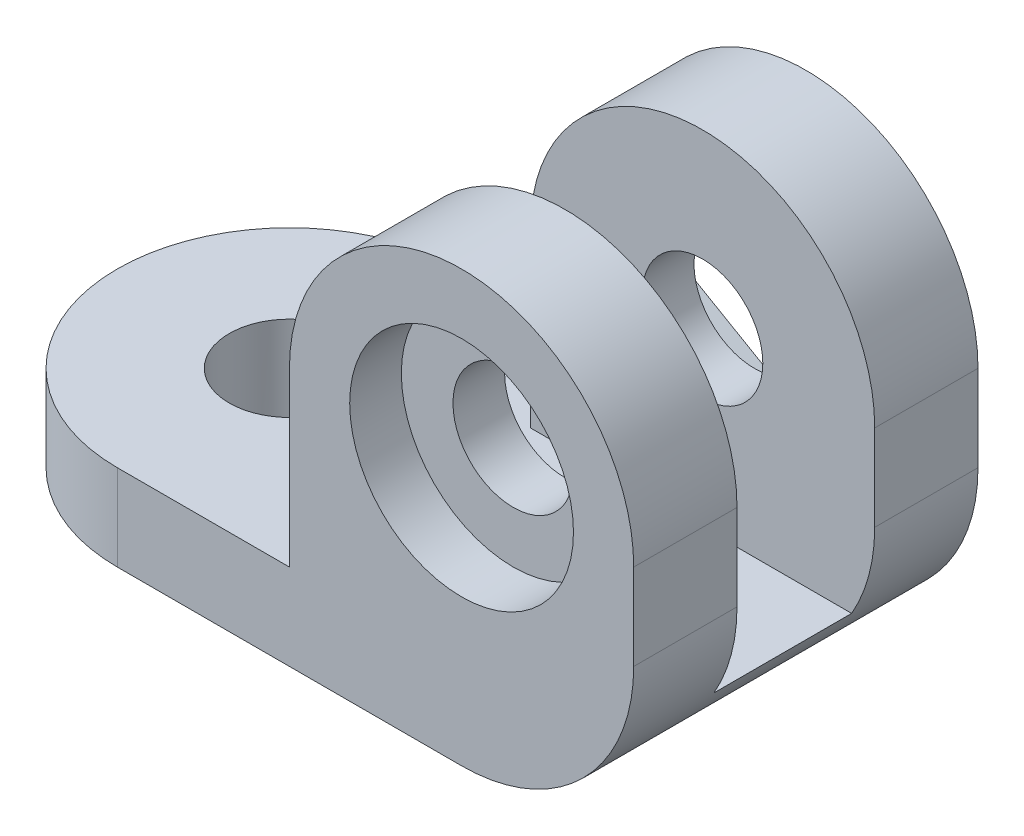
ISO-10303-21;
HEADER;
FILE_DESCRIPTION(('STEP AP214'),'2;1');
FILE_NAME('part.step','',(''),(''),'','','');
FILE_SCHEMA(('AUTOMOTIVE_DESIGN { 1 0 10303 214 1 1 1 1 }'));
ENDSEC;
DATA;
#1=APPLICATION_CONTEXT('core data for automotive mechanical design processes');
#2=APPLICATION_PROTOCOL_DEFINITION('international standard','automotive_design',2000,#1);
#3=PRODUCT_CONTEXT('',#1,'mechanical');
#4=PRODUCT('Part','Part','',(#3));
#5=PRODUCT_RELATED_PRODUCT_CATEGORY('part','',(#4));
#6=PRODUCT_DEFINITION_FORMATION('','',#4);
#7=PRODUCT_DEFINITION_CONTEXT('part definition',#1,'design');
#8=PRODUCT_DEFINITION('design','',#6,#7);
#9=PRODUCT_DEFINITION_SHAPE('','',#8);
#10=(LENGTH_UNIT() NAMED_UNIT(*) SI_UNIT(.MILLI.,.METRE.));
#11=(NAMED_UNIT(*) PLANE_ANGLE_UNIT() SI_UNIT($,.RADIAN.));
#12=(NAMED_UNIT(*) SI_UNIT($,.STERADIAN.) SOLID_ANGLE_UNIT());
#13=UNCERTAINTY_MEASURE_WITH_UNIT(LENGTH_MEASURE(1.E-05),#10,'distance_accuracy_value','');
#14=(GEOMETRIC_REPRESENTATION_CONTEXT(3) GLOBAL_UNCERTAINTY_ASSIGNED_CONTEXT((#13)) GLOBAL_UNIT_ASSIGNED_CONTEXT((#10,
#11,#12)) REPRESENTATION_CONTEXT('',''));
#15=CARTESIAN_POINT('',(0.,0.,0.));
#16=DIRECTION('',(0.,0.,1.));
#17=DIRECTION('',(1.,0.,0.));
#18=AXIS2_PLACEMENT_3D('',#15,#16,#17);
#19=CARTESIAN_POINT('',(0.,0.,10.));
#20=DIRECTION('',(0.,0.,-1.));
#21=DIRECTION('',(-1.,0.,0.));
#22=AXIS2_PLACEMENT_3D('',#19,#20,#21);
#23=CYLINDRICAL_SURFACE('',#22,1.75);
#24=CARTESIAN_POINT('',(0.,0.,7.));
#25=DIRECTION('',(0.,0.,-1.));
#26=DIRECTION('',(-1.,0.,0.));
#27=AXIS2_PLACEMENT_3D('',#24,#25,#26);
#28=CIRCLE('',#27,1.75);
#29=CARTESIAN_POINT('',(-1.75,0.,7.));
#30=VERTEX_POINT('',#29);
#31=EDGE_CURVE('E238',#30,#30,#28,.T.);
#32=ORIENTED_EDGE('',*,*,#31,.T.);
#33=EDGE_LOOP('',(#32));
#34=FACE_BOUND('',#33,.T.);
#35=CARTESIAN_POINT('',(0.,0.,8.5));
#36=DIRECTION('',(0.,0.,1.));
#37=DIRECTION('',(1.,0.,0.));
#38=AXIS2_PLACEMENT_3D('',#35,#36,#37);
#39=CIRCLE('',#38,1.75);
#40=CARTESIAN_POINT('',(1.75,0.,8.5));
#41=VERTEX_POINT('',#40);
#42=EDGE_CURVE('E44',#41,#41,#39,.T.);
#43=ORIENTED_EDGE('',*,*,#42,.T.);
#44=EDGE_LOOP('',(#43));
#45=FACE_BOUND('',#44,.T.);
#46=ADVANCED_FACE('F40',(#34,#45),#23,.F.);
#47=CARTESIAN_POINT('',(0.,0.,3.));
#48=DIRECTION('',(0.,0.,1.));
#49=DIRECTION('',(1.,0.,0.));
#50=AXIS2_PLACEMENT_3D('',#47,#48,#49);
#51=CIRCLE('',#50,1.75);
#52=CARTESIAN_POINT('',(1.75,0.,3.));
#53=VERTEX_POINT('',#52);
#54=EDGE_CURVE('E248',#53,#53,#51,.T.);
#55=ORIENTED_EDGE('',*,*,#54,.T.);
#56=EDGE_LOOP('',(#55));
#57=FACE_BOUND('',#56,.T.);
#58=CARTESIAN_POINT('',(0.,0.,1.5));
#59=DIRECTION('',(0.,0.,-1.));
#60=DIRECTION('',(-1.,0.,0.));
#61=AXIS2_PLACEMENT_3D('',#58,#59,#60);
#62=CIRCLE('',#61,1.75);
#63=CARTESIAN_POINT('',(-1.75,0.,1.5));
#64=VERTEX_POINT('',#63);
#65=EDGE_CURVE('E223',#64,#64,#62,.T.);
#66=ORIENTED_EDGE('',*,*,#65,.T.);
#67=EDGE_LOOP('',(#66));
#68=FACE_BOUND('',#67,.T.);
#69=ADVANCED_FACE('F329',(#57,#68),#23,.F.);
#70=CARTESIAN_POINT('',(5.,0.,10.));
#71=DIRECTION('',(-1.,0.,0.));
#72=DIRECTION('',(0.,-1.,0.));
#73=AXIS2_PLACEMENT_3D('',#70,#71,#72);
#74=PLANE('',#73);
#75=DIRECTION('',(0.,1.,0.));
#76=VECTOR('',#75,1.);
#77=CARTESIAN_POINT('',(5.,0.,10.));
#78=LINE('',#77,#76);
#79=CARTESIAN_POINT('',(5.,-2.5,10.));
#80=VERTEX_POINT('',#79);
#81=CARTESIAN_POINT('',(5.,0.,10.));
#82=VERTEX_POINT('',#81);
#83=EDGE_CURVE('E270',#80,#82,#78,.T.);
#84=ORIENTED_EDGE('',*,*,#83,.F.);
#85=DIRECTION('',(0.,0.,-1.));
#86=VECTOR('',#85,1.);
#87=CARTESIAN_POINT('',(5.,-2.5,0.));
#88=LINE('',#87,#86);
#89=CARTESIAN_POINT('',(5.,-2.5,7.));
#90=VERTEX_POINT('',#89);
#91=EDGE_CURVE('E315',#80,#90,#88,.T.);
#92=ORIENTED_EDGE('',*,*,#91,.T.);
#93=DIRECTION('',(0.,-1.,0.));
#94=VECTOR('',#93,1.);
#95=CARTESIAN_POINT('',(5.,0.,7.));
#96=LINE('',#95,#94);
#97=CARTESIAN_POINT('',(5.,0.,7.));
#98=VERTEX_POINT('',#97);
#99=EDGE_CURVE('E245',#98,#90,#96,.T.);
#100=ORIENTED_EDGE('',*,*,#99,.F.);
#101=DIRECTION('',(0.,0.,-1.));
#102=VECTOR('',#101,1.);
#103=CARTESIAN_POINT('',(5.,0.,10.));
#104=LINE('',#103,#102);
#105=EDGE_CURVE('E293',#82,#98,#104,.T.);
#106=ORIENTED_EDGE('',*,*,#105,.F.);
#107=EDGE_LOOP('',(#84,#92,#100,#106));
#108=FACE_BOUND('',#107,.T.);
#109=ADVANCED_FACE('F350',(#108),#74,.F.);
#110=DIRECTION('',(0.,1.,0.));
#111=VECTOR('',#110,1.);
#112=CARTESIAN_POINT('',(5.,0.,3.));
#113=LINE('',#112,#111);
#114=CARTESIAN_POINT('',(5.,-2.5,3.));
#115=VERTEX_POINT('',#114);
#116=CARTESIAN_POINT('',(5.,0.,3.));
#117=VERTEX_POINT('',#116);
#118=EDGE_CURVE('E255',#115,#117,#113,.T.);
#119=ORIENTED_EDGE('',*,*,#118,.F.);
#120=DIRECTION('',(0.,0.,-1.));
#121=VECTOR('',#120,1.);
#122=CARTESIAN_POINT('',(5.,-2.5,0.));
#123=LINE('',#122,#121);
#124=CARTESIAN_POINT('',(5.,-2.5,0.));
#125=VERTEX_POINT('',#124);
#126=EDGE_CURVE('E311',#115,#125,#123,.T.);
#127=ORIENTED_EDGE('',*,*,#126,.T.);
#128=DIRECTION('',(0.,1.,0.));
#129=VECTOR('',#128,1.);
#130=CARTESIAN_POINT('',(5.,0.,0.));
#131=LINE('',#130,#129);
#132=CARTESIAN_POINT('',(5.,0.,0.));
#133=VERTEX_POINT('',#132);
#134=EDGE_CURVE('E264',#125,#133,#131,.T.);
#135=ORIENTED_EDGE('',*,*,#134,.T.);
#136=EDGE_CURVE('E292',#117,#133,#104,.T.);
#137=ORIENTED_EDGE('',*,*,#136,.F.);
#138=EDGE_LOOP('',(#119,#127,#135,#137));
#139=FACE_BOUND('',#138,.T.);
#140=ADVANCED_FACE('F366',(#139),#74,.F.);
#141=CARTESIAN_POINT('',(0.,0.,10.));
#142=DIRECTION('',(0.,0.,-1.));
#143=DIRECTION('',(-1.,0.,0.));
#144=AXIS2_PLACEMENT_3D('',#141,#142,#143);
#145=CYLINDRICAL_SURFACE('',#144,5.);
#146=CARTESIAN_POINT('',(0.,0.,3.));
#147=DIRECTION('',(0.,0.,1.));
#148=DIRECTION('',(1.,0.,0.));
#149=AXIS2_PLACEMENT_3D('',#146,#147,#148);
#150=CIRCLE('',#149,5.);
#151=CARTESIAN_POINT('',(-5.,0.,3.));
#152=VERTEX_POINT('',#151);
#153=EDGE_CURVE('E253',#117,#152,#150,.T.);
#154=ORIENTED_EDGE('',*,*,#153,.F.);
#155=ORIENTED_EDGE('',*,*,#136,.T.);
#156=CARTESIAN_POINT('',(0.,0.,0.));
#157=DIRECTION('',(0.,0.,1.));
#158=DIRECTION('',(1.,0.,0.));
#159=AXIS2_PLACEMENT_3D('',#156,#157,#158);
#160=CIRCLE('',#159,5.);
#161=CARTESIAN_POINT('',(-5.,0.,0.));
#162=VERTEX_POINT('',#161);
#163=EDGE_CURVE('E280',#133,#162,#160,.T.);
#164=ORIENTED_EDGE('',*,*,#163,.T.);
#165=DIRECTION('',(0.,0.,-1.));
#166=VECTOR('',#165,1.);
#167=CARTESIAN_POINT('',(-5.,0.,10.));
#168=LINE('',#167,#166);
#169=EDGE_CURVE('E288',#152,#162,#168,.T.);
#170=ORIENTED_EDGE('',*,*,#169,.F.);
#171=EDGE_LOOP('',(#154,#155,#164,#170));
#172=FACE_BOUND('',#171,.T.);
#173=ADVANCED_FACE('F363',(#172),#145,.T.);
#174=CARTESIAN_POINT('',(0.,0.,7.));
#175=DIRECTION('',(0.,0.,-1.));
#176=DIRECTION('',(-1.,0.,0.));
#177=AXIS2_PLACEMENT_3D('',#174,#175,#176);
#178=CIRCLE('',#177,5.);
#179=CARTESIAN_POINT('',(-5.,0.,7.));
#180=VERTEX_POINT('',#179);
#181=EDGE_CURVE('E243',#180,#98,#178,.T.);
#182=ORIENTED_EDGE('',*,*,#181,.F.);
#183=CARTESIAN_POINT('',(-5.,0.,10.));
#184=VERTEX_POINT('',#183);
#185=EDGE_CURVE('E289',#184,#180,#168,.T.);
#186=ORIENTED_EDGE('',*,*,#185,.F.);
#187=CARTESIAN_POINT('',(0.,0.,10.));
#188=DIRECTION('',(0.,0.,1.));
#189=DIRECTION('',(1.,0.,0.));
#190=AXIS2_PLACEMENT_3D('',#187,#188,#189);
#191=CIRCLE('',#190,5.);
#192=EDGE_CURVE('E272',#82,#184,#191,.T.);
#193=ORIENTED_EDGE('',*,*,#192,.F.);
#194=ORIENTED_EDGE('',*,*,#105,.T.);
#195=EDGE_LOOP('',(#182,#186,#193,#194));
#196=FACE_BOUND('',#195,.T.);
#197=ADVANCED_FACE('F361',(#196),#145,.T.);
#198=CARTESIAN_POINT('',(-5.,0.,10.));
#199=DIRECTION('',(1.,0.,0.));
#200=DIRECTION('',(0.,1.,0.));
#201=AXIS2_PLACEMENT_3D('',#198,#199,#200);
#202=PLANE('',#201);
#203=DIRECTION('',(0.,-1.,0.));
#204=VECTOR('',#203,1.);
#205=CARTESIAN_POINT('',(-5.,0.,3.));
#206=LINE('',#205,#204);
#207=CARTESIAN_POINT('',(-5.,-5.,3.));
#208=VERTEX_POINT('',#207);
#209=EDGE_CURVE('E251',#152,#208,#206,.T.);
#210=ORIENTED_EDGE('',*,*,#209,.F.);
#211=ORIENTED_EDGE('',*,*,#169,.T.);
#212=DIRECTION('',(0.,-1.,0.));
#213=VECTOR('',#212,1.);
#214=CARTESIAN_POINT('',(-5.,0.,0.));
#215=LINE('',#214,#213);
#216=CARTESIAN_POINT('',(-5.,-5.,0.));
#217=VERTEX_POINT('',#216);
#218=EDGE_CURVE('E273',#162,#217,#215,.T.);
#219=ORIENTED_EDGE('',*,*,#218,.T.);
#220=DIRECTION('',(0.,0.,-1.));
#221=VECTOR('',#220,1.);
#222=CARTESIAN_POINT('',(-5.,-5.,10.));
#223=LINE('',#222,#221);
#224=EDGE_CURVE('E278',#208,#217,#223,.T.);
#225=ORIENTED_EDGE('',*,*,#224,.F.);
#226=EDGE_LOOP('',(#210,#211,#219,#225));
#227=FACE_BOUND('',#226,.T.);
#228=ADVANCED_FACE('F357',(#227),#202,.F.);
#229=DIRECTION('',(0.,1.,0.));
#230=VECTOR('',#229,1.);
#231=CARTESIAN_POINT('',(-5.,0.,7.));
#232=LINE('',#231,#230);
#233=CARTESIAN_POINT('',(-5.,-5.,7.));
#234=VERTEX_POINT('',#233);
#235=EDGE_CURVE('E241',#234,#180,#232,.T.);
#236=ORIENTED_EDGE('',*,*,#235,.F.);
#237=CARTESIAN_POINT('',(-5.,-5.,10.));
#238=VERTEX_POINT('',#237);
#239=EDGE_CURVE('E285',#238,#234,#223,.T.);
#240=ORIENTED_EDGE('',*,*,#239,.F.);
#241=DIRECTION('',(0.,-1.,0.));
#242=VECTOR('',#241,1.);
#243=CARTESIAN_POINT('',(-5.,0.,10.));
#244=LINE('',#243,#242);
#245=EDGE_CURVE('E275',#184,#238,#244,.T.);
#246=ORIENTED_EDGE('',*,*,#245,.F.);
#247=ORIENTED_EDGE('',*,*,#185,.T.);
#248=EDGE_LOOP('',(#236,#240,#246,#247));
#249=FACE_BOUND('',#248,.T.);
#250=ADVANCED_FACE('F360',(#249),#202,.F.);
#251=CARTESIAN_POINT('',(0.,0.,10.));
#252=DIRECTION('',(0.,0.,1.));
#253=DIRECTION('',(1.,0.,0.));
#254=AXIS2_PLACEMENT_3D('',#251,#252,#253);
#255=PLANE('',#254);
#256=CARTESIAN_POINT('',(0.,0.,10.));
#257=DIRECTION('',(0.,0.,1.));
#258=DIRECTION('',(1.,0.,0.));
#259=AXIS2_PLACEMENT_3D('',#256,#257,#258);
#260=CIRCLE('',#259,3.25);
#261=CARTESIAN_POINT('',(3.25,0.,10.));
#262=VERTEX_POINT('',#261);
#263=EDGE_CURVE('E200',#262,#262,#260,.T.);
#264=ORIENTED_EDGE('',*,*,#263,.F.);
#265=EDGE_LOOP('',(#264));
#266=FACE_BOUND('',#265,.T.);
#267=DIRECTION('',(1.,0.,0.));
#268=VECTOR('',#267,1.);
#269=CARTESIAN_POINT('',(-15.,-7.49999999999999,10.));
#270=LINE('',#269,#268);
#271=CARTESIAN_POINT('',(-10.,-7.5,10.));
#272=VERTEX_POINT('',#271);
#273=CARTESIAN_POINT('',(0.,-7.5,10.));
#274=VERTEX_POINT('',#273);
#275=EDGE_CURVE('E261',#272,#274,#270,.T.);
#276=ORIENTED_EDGE('',*,*,#275,.T.);
#277=CARTESIAN_POINT('',(0.,-2.5,10.));
#278=DIRECTION('',(0.,0.,1.));
#279=DIRECTION('',(1.,0.,0.));
#280=AXIS2_PLACEMENT_3D('',#277,#278,#279);
#281=CIRCLE('',#280,5.);
#282=EDGE_CURVE('E12',#274,#80,#281,.T.);
#283=ORIENTED_EDGE('',*,*,#282,.T.);
#284=ORIENTED_EDGE('',*,*,#83,.T.);
#285=ORIENTED_EDGE('',*,*,#192,.T.);
#286=ORIENTED_EDGE('',*,*,#245,.T.);
#287=DIRECTION('',(1.,0.,0.));
#288=VECTOR('',#287,1.);
#289=CARTESIAN_POINT('',(-15.,-5.,10.));
#290=LINE('',#289,#288);
#291=CARTESIAN_POINT('',(-10.,-5.,10.));
#292=VERTEX_POINT('',#291);
#293=EDGE_CURVE('E262',#292,#238,#290,.T.);
#294=ORIENTED_EDGE('',*,*,#293,.F.);
#295=DIRECTION('',(0.,-1.,0.));
#296=VECTOR('',#295,1.);
#297=CARTESIAN_POINT('',(-10.,-7.5,10.));
#298=LINE('',#297,#296);
#299=EDGE_CURVE('E296',#292,#272,#298,.T.);
#300=ORIENTED_EDGE('',*,*,#299,.T.);
#301=EDGE_LOOP('',(#276,#283,#284,#285,#286,#294,#300));
#302=FACE_BOUND('',#301,.T.);
#303=ADVANCED_FACE('F395',(#266,#302),#255,.T.);
#304=CARTESIAN_POINT('',(0.,0.,0.));
#305=DIRECTION('',(0.,0.,1.));
#306=DIRECTION('',(1.,0.,0.));
#307=AXIS2_PLACEMENT_3D('',#304,#305,#306);
#308=PLANE('',#307);
#309=DIRECTION('',(0.866025403784439,-0.5,0.));
#310=VECTOR('',#309,1.);
#311=CARTESIAN_POINT('',(0.,3.75277674973257,0.));
#312=LINE('',#311,#310);
#313=CARTESIAN_POINT('',(0.,3.75277674973257,0.));
#314=VERTEX_POINT('',#313);
#315=CARTESIAN_POINT('',(3.25,1.87638837486629,0.));
#316=VERTEX_POINT('',#315);
#317=EDGE_CURVE('E211',#314,#316,#312,.T.);
#318=ORIENTED_EDGE('',*,*,#317,.F.);
#319=DIRECTION('',(0.866025403784439,0.5,0.));
#320=VECTOR('',#319,1.);
#321=CARTESIAN_POINT('',(-3.25,1.87638837486629,0.));
#322=LINE('',#321,#320);
#323=CARTESIAN_POINT('',(-3.25,1.87638837486629,0.));
#324=VERTEX_POINT('',#323);
#325=EDGE_CURVE('E57',#324,#314,#322,.T.);
#326=ORIENTED_EDGE('',*,*,#325,.F.);
#327=DIRECTION('',(0.,1.,0.));
#328=VECTOR('',#327,1.);
#329=CARTESIAN_POINT('',(-3.25,-1.87638837486628,0.));
#330=LINE('',#329,#328);
#331=CARTESIAN_POINT('',(-3.25,-1.87638837486628,0.));
#332=VERTEX_POINT('',#331);
#333=EDGE_CURVE('E194',#332,#324,#330,.T.);
#334=ORIENTED_EDGE('',*,*,#333,.F.);
#335=DIRECTION('',(-0.866025403784439,0.5,0.));
#336=VECTOR('',#335,1.);
#337=CARTESIAN_POINT('',(0.,-3.75277674973257,0.));
#338=LINE('',#337,#336);
#339=CARTESIAN_POINT('',(0.,-3.75277674973257,0.));
#340=VERTEX_POINT('',#339);
#341=EDGE_CURVE('E197',#340,#332,#338,.T.);
#342=ORIENTED_EDGE('',*,*,#341,.F.);
#343=DIRECTION('',(-0.866025403784439,-0.5,0.));
#344=VECTOR('',#343,1.);
#345=CARTESIAN_POINT('',(3.25,-1.87638837486628,0.));
#346=LINE('',#345,#344);
#347=CARTESIAN_POINT('',(3.25,-1.87638837486628,0.));
#348=VERTEX_POINT('',#347);
#349=EDGE_CURVE('E216',#348,#340,#346,.T.);
#350=ORIENTED_EDGE('',*,*,#349,.F.);
#351=DIRECTION('',(0.,-1.,0.));
#352=VECTOR('',#351,1.);
#353=CARTESIAN_POINT('',(3.25,1.87638837486629,0.));
#354=LINE('',#353,#352);
#355=EDGE_CURVE('E213',#316,#348,#354,.T.);
#356=ORIENTED_EDGE('',*,*,#355,.F.);
#357=EDGE_LOOP('',(#318,#326,#334,#342,#350,#356));
#358=FACE_BOUND('',#357,.T.);
#359=ORIENTED_EDGE('',*,*,#134,.F.);
#360=CARTESIAN_POINT('',(0.,-2.5,0.));
#361=DIRECTION('',(0.,0.,1.));
#362=DIRECTION('',(1.,0.,0.));
#363=AXIS2_PLACEMENT_3D('',#360,#361,#362);
#364=CIRCLE('',#363,5.);
#365=CARTESIAN_POINT('',(0.,-7.5,0.));
#366=VERTEX_POINT('',#365);
#367=EDGE_CURVE('E324',#125,#366,#364,.F.);
#368=ORIENTED_EDGE('',*,*,#367,.T.);
#369=DIRECTION('',(1.,0.,0.));
#370=VECTOR('',#369,1.);
#371=CARTESIAN_POINT('',(-15.,-7.5,0.));
#372=LINE('',#371,#370);
#373=CARTESIAN_POINT('',(-10.,-7.5,0.));
#374=VERTEX_POINT('',#373);
#375=EDGE_CURVE('E267',#374,#366,#372,.T.);
#376=ORIENTED_EDGE('',*,*,#375,.F.);
#377=DIRECTION('',(0.,-1.,0.));
#378=VECTOR('',#377,1.);
#379=CARTESIAN_POINT('',(-10.,0.,0.));
#380=LINE('',#379,#378);
#381=CARTESIAN_POINT('',(-10.,-5.,0.));
#382=VERTEX_POINT('',#381);
#383=EDGE_CURVE('E309',#374,#382,#380,.F.);
#384=ORIENTED_EDGE('',*,*,#383,.T.);
#385=DIRECTION('',(1.,0.,0.));
#386=VECTOR('',#385,1.);
#387=CARTESIAN_POINT('',(-15.,-5.,0.));
#388=LINE('',#387,#386);
#389=EDGE_CURVE('E265',#382,#217,#388,.T.);
#390=ORIENTED_EDGE('',*,*,#389,.T.);
#391=ORIENTED_EDGE('',*,*,#218,.F.);
#392=ORIENTED_EDGE('',*,*,#163,.F.);
#393=EDGE_LOOP('',(#359,#368,#376,#384,#390,#391,#392));
#394=FACE_BOUND('',#393,.T.);
#395=ADVANCED_FACE('F355',(#358,#394),#308,.F.);
#396=CARTESIAN_POINT('',(-15.,-5.,0.));
#397=DIRECTION('',(0.,-1.,0.));
#398=DIRECTION('',(1.,0.,0.));
#399=AXIS2_PLACEMENT_3D('',#396,#397,#398);
#400=PLANE('',#399);
#401=CARTESIAN_POINT('',(-10.,-5.,5.));
#402=DIRECTION('',(0.,-1.,0.));
#403=DIRECTION('',(1.,0.,0.));
#404=AXIS2_PLACEMENT_3D('',#401,#402,#403);
#405=CIRCLE('',#404,1.75);
#406=CARTESIAN_POINT('',(-8.25,-5.,5.));
#407=VERTEX_POINT('',#406);
#408=EDGE_CURVE('E258',#407,#407,#405,.T.);
#409=ORIENTED_EDGE('',*,*,#408,.T.);
#410=EDGE_LOOP('',(#409));
#411=FACE_BOUND('',#410,.T.);
#412=DIRECTION('',(1.,0.,0.));
#413=VECTOR('',#412,1.);
#414=CARTESIAN_POINT('',(-17.,-5.,7.));
#415=LINE('',#414,#413);
#416=CARTESIAN_POINT('',(4.33012701892219,-5.,7.));
#417=VERTEX_POINT('',#416);
#418=EDGE_CURVE('E231',#234,#417,#415,.T.);
#419=ORIENTED_EDGE('',*,*,#418,.T.);
#420=DIRECTION('',(0.,0.,1.));
#421=VECTOR('',#420,1.);
#422=CARTESIAN_POINT('',(4.33012701892219,-5.,7.));
#423=LINE('',#422,#421);
#424=CARTESIAN_POINT('',(4.33012701892219,-5.,3.));
#425=VERTEX_POINT('',#424);
#426=EDGE_CURVE('E320',#417,#425,#423,.F.);
#427=ORIENTED_EDGE('',*,*,#426,.T.);
#428=DIRECTION('',(1.,0.,0.));
#429=VECTOR('',#428,1.);
#430=CARTESIAN_POINT('',(-17.,-5.,3.));
#431=LINE('',#430,#429);
#432=EDGE_CURVE('E234',#208,#425,#431,.T.);
#433=ORIENTED_EDGE('',*,*,#432,.F.);
#434=ORIENTED_EDGE('',*,*,#224,.T.);
#435=ORIENTED_EDGE('',*,*,#389,.F.);
#436=CARTESIAN_POINT('',(-10.,-5.,5.));
#437=DIRECTION('',(0.,-1.,0.));
#438=DIRECTION('',(1.,0.,0.));
#439=AXIS2_PLACEMENT_3D('',#436,#437,#438);
#440=CIRCLE('',#439,5.);
#441=CARTESIAN_POINT('',(-15.,-5.,5.));
#442=VERTEX_POINT('',#441);
#443=EDGE_CURVE('E305',#382,#442,#440,.F.);
#444=ORIENTED_EDGE('',*,*,#443,.T.);
#445=CARTESIAN_POINT('',(-10.,-5.,5.));
#446=DIRECTION('',(0.,-1.,0.));
#447=DIRECTION('',(1.,0.,0.));
#448=AXIS2_PLACEMENT_3D('',#445,#446,#447);
#449=CIRCLE('',#448,5.);
#450=EDGE_CURVE('E307',#442,#292,#449,.F.);
#451=ORIENTED_EDGE('',*,*,#450,.T.);
#452=ORIENTED_EDGE('',*,*,#293,.T.);
#453=ORIENTED_EDGE('',*,*,#239,.T.);
#454=EDGE_LOOP('',(#419,#427,#433,#434,#435,#444,#451,#452,#453));
#455=FACE_BOUND('',#454,.T.);
#456=ADVANCED_FACE('F392',(#411,#455),#400,.F.);
#457=CARTESIAN_POINT('',(-15.,-7.5,0.));
#458=DIRECTION('',(0.,-1.,0.));
#459=DIRECTION('',(0.,0.,-1.));
#460=AXIS2_PLACEMENT_3D('',#457,#458,#459);
#461=PLANE('',#460);
#462=CARTESIAN_POINT('',(-10.,-7.5,5.));
#463=DIRECTION('',(0.,-1.,0.));
#464=DIRECTION('',(0.,0.,-1.));
#465=AXIS2_PLACEMENT_3D('',#462,#463,#464);
#466=CIRCLE('',#465,1.75);
#467=CARTESIAN_POINT('',(-10.,-7.5,3.25));
#468=VERTEX_POINT('',#467);
#469=EDGE_CURVE('E257',#468,#468,#466,.T.);
#470=ORIENTED_EDGE('',*,*,#469,.F.);
#471=EDGE_LOOP('',(#470));
#472=FACE_BOUND('',#471,.T.);
#473=ORIENTED_EDGE('',*,*,#375,.T.);
#474=DIRECTION('',(0.,0.,-1.));
#475=VECTOR('',#474,1.);
#476=CARTESIAN_POINT('',(0.,-7.5,10.));
#477=LINE('',#476,#475);
#478=EDGE_CURVE('E49',#366,#274,#477,.F.);
#479=ORIENTED_EDGE('',*,*,#478,.T.);
#480=ORIENTED_EDGE('',*,*,#275,.F.);
#481=CARTESIAN_POINT('',(-10.,-7.5,5.));
#482=DIRECTION('',(0.,-1.,0.));
#483=DIRECTION('',(0.,0.,-1.));
#484=AXIS2_PLACEMENT_3D('',#481,#482,#483);
#485=CIRCLE('',#484,5.);
#486=CARTESIAN_POINT('',(-15.,-7.5,5.));
#487=VERTEX_POINT('',#486);
#488=EDGE_CURVE('E303',#272,#487,#485,.T.);
#489=ORIENTED_EDGE('',*,*,#488,.T.);
#490=CARTESIAN_POINT('',(-10.,-7.5,5.));
#491=DIRECTION('',(0.,-1.,0.));
#492=DIRECTION('',(0.,0.,-1.));
#493=AXIS2_PLACEMENT_3D('',#490,#491,#492);
#494=CIRCLE('',#493,5.);
#495=EDGE_CURVE('E301',#487,#374,#494,.T.);
#496=ORIENTED_EDGE('',*,*,#495,.T.);
#497=EDGE_LOOP('',(#473,#479,#480,#489,#496));
#498=FACE_BOUND('',#497,.T.);
#499=ADVANCED_FACE('F425',(#472,#498),#461,.T.);
#500=CARTESIAN_POINT('',(-10.,9.00000000000001,5.));
#501=DIRECTION('',(0.,-1.,0.));
#502=DIRECTION('',(1.,0.,0.));
#503=AXIS2_PLACEMENT_3D('',#500,#501,#502);
#504=CYLINDRICAL_SURFACE('',#503,1.75);
#505=ORIENTED_EDGE('',*,*,#469,.T.);
#506=EDGE_LOOP('',(#505));
#507=FACE_BOUND('',#506,.T.);
#508=ORIENTED_EDGE('',*,*,#408,.F.);
#509=EDGE_LOOP('',(#508));
#510=FACE_BOUND('',#509,.T.);
#511=ADVANCED_FACE('F475',(#507,#510),#504,.F.);
#512=CARTESIAN_POINT('',(-17.,-5.,3.));
#513=DIRECTION('',(0.,0.,1.));
#514=DIRECTION('',(1.,0.,0.));
#515=AXIS2_PLACEMENT_3D('',#512,#513,#514);
#516=PLANE('',#515);
#517=ORIENTED_EDGE('',*,*,#54,.F.);
#518=EDGE_LOOP('',(#517));
#519=FACE_BOUND('',#518,.T.);
#520=ORIENTED_EDGE('',*,*,#432,.T.);
#521=CARTESIAN_POINT('',(0.,-2.5,3.));
#522=DIRECTION('',(0.,0.,1.));
#523=DIRECTION('',(1.,0.,0.));
#524=AXIS2_PLACEMENT_3D('',#521,#522,#523);
#525=CIRCLE('',#524,5.);
#526=EDGE_CURVE('E322',#425,#115,#525,.T.);
#527=ORIENTED_EDGE('',*,*,#526,.T.);
#528=ORIENTED_EDGE('',*,*,#118,.T.);
#529=ORIENTED_EDGE('',*,*,#153,.T.);
#530=ORIENTED_EDGE('',*,*,#209,.T.);
#531=EDGE_LOOP('',(#520,#527,#528,#529,#530));
#532=FACE_BOUND('',#531,.T.);
#533=ADVANCED_FACE('F381',(#519,#532),#516,.T.);
#534=CARTESIAN_POINT('',(-17.,-5.,7.));
#535=DIRECTION('',(0.,0.,-1.));
#536=DIRECTION('',(-1.,0.,0.));
#537=AXIS2_PLACEMENT_3D('',#534,#535,#536);
#538=PLANE('',#537);
#539=ORIENTED_EDGE('',*,*,#31,.F.);
#540=EDGE_LOOP('',(#539));
#541=FACE_BOUND('',#540,.T.);
#542=ORIENTED_EDGE('',*,*,#99,.T.);
#543=CARTESIAN_POINT('',(0.,-2.5,7.));
#544=DIRECTION('',(0.,0.,-1.));
#545=DIRECTION('',(-1.,0.,0.));
#546=AXIS2_PLACEMENT_3D('',#543,#544,#545);
#547=CIRCLE('',#546,5.);
#548=EDGE_CURVE('E318',#90,#417,#547,.T.);
#549=ORIENTED_EDGE('',*,*,#548,.T.);
#550=ORIENTED_EDGE('',*,*,#418,.F.);
#551=ORIENTED_EDGE('',*,*,#235,.T.);
#552=ORIENTED_EDGE('',*,*,#181,.T.);
#553=EDGE_LOOP('',(#542,#549,#550,#551,#552));
#554=FACE_BOUND('',#553,.T.);
#555=ADVANCED_FACE('F376',(#541,#554),#538,.T.);
#556=CARTESIAN_POINT('',(-10.,0.,5.));
#557=DIRECTION('',(0.,-1.,0.));
#558=DIRECTION('',(1.,0.,0.));
#559=AXIS2_PLACEMENT_3D('',#556,#557,#558);
#560=CYLINDRICAL_SURFACE('',#559,5.);
#561=DIRECTION('',(0.,-1.,0.));
#562=VECTOR('',#561,1.);
#563=CARTESIAN_POINT('',(-15.,0.,5.));
#564=LINE('',#563,#562);
#565=EDGE_CURVE('E235',#442,#487,#564,.T.);
#566=ORIENTED_EDGE('',*,*,#565,.F.);
#567=ORIENTED_EDGE('',*,*,#443,.F.);
#568=ORIENTED_EDGE('',*,*,#383,.F.);
#569=ORIENTED_EDGE('',*,*,#495,.F.);
#570=EDGE_LOOP('',(#566,#567,#568,#569));
#571=FACE_BOUND('',#570,.T.);
#572=ADVANCED_FACE('F373',(#571),#560,.T.);
#573=CARTESIAN_POINT('',(-10.,0.,5.));
#574=DIRECTION('',(0.,1.,0.));
#575=DIRECTION('',(-1.,0.,0.));
#576=AXIS2_PLACEMENT_3D('',#573,#574,#575);
#577=CYLINDRICAL_SURFACE('',#576,5.);
#578=ORIENTED_EDGE('',*,*,#450,.F.);
#579=ORIENTED_EDGE('',*,*,#565,.T.);
#580=ORIENTED_EDGE('',*,*,#488,.F.);
#581=ORIENTED_EDGE('',*,*,#299,.F.);
#582=EDGE_LOOP('',(#578,#579,#580,#581));
#583=FACE_BOUND('',#582,.T.);
#584=ADVANCED_FACE('F371',(#583),#577,.T.);
#585=CARTESIAN_POINT('',(0.,-2.5,10.));
#586=DIRECTION('',(0.,0.,1.));
#587=DIRECTION('',(0.,-1.,0.));
#588=AXIS2_PLACEMENT_3D('',#585,#586,#587);
#589=CYLINDRICAL_SURFACE('',#588,5.);
#590=ORIENTED_EDGE('',*,*,#282,.F.);
#591=ORIENTED_EDGE('',*,*,#478,.F.);
#592=ORIENTED_EDGE('',*,*,#367,.F.);
#593=ORIENTED_EDGE('',*,*,#126,.F.);
#594=ORIENTED_EDGE('',*,*,#526,.F.);
#595=ORIENTED_EDGE('',*,*,#426,.F.);
#596=ORIENTED_EDGE('',*,*,#548,.F.);
#597=ORIENTED_EDGE('',*,*,#91,.F.);
#598=EDGE_LOOP('',(#590,#591,#592,#593,#594,#595,#596,#597));
#599=FACE_BOUND('',#598,.T.);
#600=ADVANCED_FACE('F42',(#599),#589,.T.);
#601=CARTESIAN_POINT('',(-3.25,1.87638837486629,1.5));
#602=DIRECTION('',(-0.5,0.866025403784438,0.));
#603=DIRECTION('',(-0.866025403784439,-0.5,0.));
#604=AXIS2_PLACEMENT_3D('',#601,#602,#603);
#605=PLANE('',#604);
#606=ORIENTED_EDGE('',*,*,#325,.T.);
#607=DIRECTION('',(0.,0.,-1.));
#608=VECTOR('',#607,1.);
#609=CARTESIAN_POINT('',(0.,3.75277674973257,1.5));
#610=LINE('',#609,#608);
#611=CARTESIAN_POINT('',(0.,3.75277674973257,1.5));
#612=VERTEX_POINT('',#611);
#613=EDGE_CURVE('E171',#612,#314,#610,.T.);
#614=ORIENTED_EDGE('',*,*,#613,.F.);
#615=DIRECTION('',(0.866025403784439,0.5,0.));
#616=VECTOR('',#615,1.);
#617=CARTESIAN_POINT('',(-3.25,1.87638837486629,1.5));
#618=LINE('',#617,#616);
#619=CARTESIAN_POINT('',(-3.25,1.87638837486629,1.5));
#620=VERTEX_POINT('',#619);
#621=EDGE_CURVE('E175',#620,#612,#618,.T.);
#622=ORIENTED_EDGE('',*,*,#621,.F.);
#623=DIRECTION('',(0.,0.,-1.));
#624=VECTOR('',#623,1.);
#625=CARTESIAN_POINT('',(-3.25,1.87638837486629,1.5));
#626=LINE('',#625,#624);
#627=EDGE_CURVE('E221',#620,#324,#626,.T.);
#628=ORIENTED_EDGE('',*,*,#627,.T.);
#629=EDGE_LOOP('',(#606,#614,#622,#628));
#630=FACE_BOUND('',#629,.T.);
#631=ADVANCED_FACE('F173',(#630),#605,.F.);
#632=CARTESIAN_POINT('',(-3.25,-1.87638837486628,1.5));
#633=DIRECTION('',(-1.,0.,0.));
#634=DIRECTION('',(0.,-1.,0.));
#635=AXIS2_PLACEMENT_3D('',#632,#633,#634);
#636=PLANE('',#635);
#637=ORIENTED_EDGE('',*,*,#333,.T.);
#638=ORIENTED_EDGE('',*,*,#627,.F.);
#639=DIRECTION('',(0.,1.,0.));
#640=VECTOR('',#639,1.);
#641=CARTESIAN_POINT('',(-3.25,-1.87638837486628,1.5));
#642=LINE('',#641,#640);
#643=CARTESIAN_POINT('',(-3.25,-1.87638837486628,1.5));
#644=VERTEX_POINT('',#643);
#645=EDGE_CURVE('E181',#644,#620,#642,.T.);
#646=ORIENTED_EDGE('',*,*,#645,.F.);
#647=DIRECTION('',(0.,0.,-1.));
#648=VECTOR('',#647,1.);
#649=CARTESIAN_POINT('',(-3.25,-1.87638837486628,1.5));
#650=LINE('',#649,#648);
#651=EDGE_CURVE('E224',#644,#332,#650,.T.);
#652=ORIENTED_EDGE('',*,*,#651,.T.);
#653=EDGE_LOOP('',(#637,#638,#646,#652));
#654=FACE_BOUND('',#653,.T.);
#655=ADVANCED_FACE('F593',(#654),#636,.F.);
#656=CARTESIAN_POINT('',(0.,-3.75277674973257,1.5));
#657=DIRECTION('',(-0.5,-0.866025403784439,0.));
#658=DIRECTION('',(0.866025403784439,-0.5,0.));
#659=AXIS2_PLACEMENT_3D('',#656,#657,#658);
#660=PLANE('',#659);
#661=ORIENTED_EDGE('',*,*,#341,.T.);
#662=ORIENTED_EDGE('',*,*,#651,.F.);
#663=DIRECTION('',(-0.866025403784439,0.5,0.));
#664=VECTOR('',#663,1.);
#665=CARTESIAN_POINT('',(0.,-3.75277674973257,1.5));
#666=LINE('',#665,#664);
#667=CARTESIAN_POINT('',(0.,-3.75277674973257,1.5));
#668=VERTEX_POINT('',#667);
#669=EDGE_CURVE('E207',#668,#644,#666,.T.);
#670=ORIENTED_EDGE('',*,*,#669,.F.);
#671=DIRECTION('',(0.,0.,-1.));
#672=VECTOR('',#671,1.);
#673=CARTESIAN_POINT('',(0.,-3.75277674973257,1.5));
#674=LINE('',#673,#672);
#675=EDGE_CURVE('E226',#668,#340,#674,.T.);
#676=ORIENTED_EDGE('',*,*,#675,.T.);
#677=EDGE_LOOP('',(#661,#662,#670,#676));
#678=FACE_BOUND('',#677,.T.);
#679=ADVANCED_FACE('F601',(#678),#660,.F.);
#680=CARTESIAN_POINT('',(3.25,-1.87638837486628,1.5));
#681=DIRECTION('',(0.5,-0.866025403784438,0.));
#682=DIRECTION('',(0.866025403784439,0.5,0.));
#683=AXIS2_PLACEMENT_3D('',#680,#681,#682);
#684=PLANE('',#683);
#685=ORIENTED_EDGE('',*,*,#349,.T.);
#686=ORIENTED_EDGE('',*,*,#675,.F.);
#687=DIRECTION('',(-0.866025403784439,-0.5,0.));
#688=VECTOR('',#687,1.);
#689=CARTESIAN_POINT('',(3.25,-1.87638837486628,1.5));
#690=LINE('',#689,#688);
#691=CARTESIAN_POINT('',(3.25,-1.87638837486628,1.5));
#692=VERTEX_POINT('',#691);
#693=EDGE_CURVE('E204',#692,#668,#690,.T.);
#694=ORIENTED_EDGE('',*,*,#693,.F.);
#695=DIRECTION('',(0.,0.,-1.));
#696=VECTOR('',#695,1.);
#697=CARTESIAN_POINT('',(3.25,-1.87638837486628,1.5));
#698=LINE('',#697,#696);
#699=EDGE_CURVE('E228',#692,#348,#698,.T.);
#700=ORIENTED_EDGE('',*,*,#699,.T.);
#701=EDGE_LOOP('',(#685,#686,#694,#700));
#702=FACE_BOUND('',#701,.T.);
#703=ADVANCED_FACE('F609',(#702),#684,.F.);
#704=CARTESIAN_POINT('',(3.25,1.87638837486629,1.5));
#705=DIRECTION('',(1.,0.,0.));
#706=DIRECTION('',(0.,0.,-1.));
#707=AXIS2_PLACEMENT_3D('',#704,#705,#706);
#708=PLANE('',#707);
#709=ORIENTED_EDGE('',*,*,#355,.T.);
#710=ORIENTED_EDGE('',*,*,#699,.F.);
#711=DIRECTION('',(0.,-1.,0.));
#712=VECTOR('',#711,1.);
#713=CARTESIAN_POINT('',(3.25,1.87638837486629,1.5));
#714=LINE('',#713,#712);
#715=CARTESIAN_POINT('',(3.25,1.87638837486629,1.5));
#716=VERTEX_POINT('',#715);
#717=EDGE_CURVE('E189',#716,#692,#714,.T.);
#718=ORIENTED_EDGE('',*,*,#717,.F.);
#719=DIRECTION('',(0.,0.,-1.));
#720=VECTOR('',#719,1.);
#721=CARTESIAN_POINT('',(3.25,1.87638837486629,1.5));
#722=LINE('',#721,#720);
#723=EDGE_CURVE('E180',#716,#316,#722,.T.);
#724=ORIENTED_EDGE('',*,*,#723,.T.);
#725=EDGE_LOOP('',(#709,#710,#718,#724));
#726=FACE_BOUND('',#725,.T.);
#727=ADVANCED_FACE('F341',(#726),#708,.F.);
#728=CARTESIAN_POINT('',(0.,3.75277674973257,1.5));
#729=DIRECTION('',(0.5,0.866025403784439,0.));
#730=DIRECTION('',(-0.866025403784439,0.5,0.));
#731=AXIS2_PLACEMENT_3D('',#728,#729,#730);
#732=PLANE('',#731);
#733=ORIENTED_EDGE('',*,*,#317,.T.);
#734=ORIENTED_EDGE('',*,*,#723,.F.);
#735=DIRECTION('',(0.866025403784439,-0.5,0.));
#736=VECTOR('',#735,1.);
#737=CARTESIAN_POINT('',(0.,3.75277674973257,1.5));
#738=LINE('',#737,#736);
#739=EDGE_CURVE('E184',#612,#716,#738,.T.);
#740=ORIENTED_EDGE('',*,*,#739,.F.);
#741=ORIENTED_EDGE('',*,*,#613,.T.);
#742=EDGE_LOOP('',(#733,#734,#740,#741));
#743=FACE_BOUND('',#742,.T.);
#744=ADVANCED_FACE('F185',(#743),#732,.F.);
#745=CARTESIAN_POINT('',(0.,0.,1.5));
#746=DIRECTION('',(0.,0.,-1.));
#747=DIRECTION('',(-1.,0.,0.));
#748=AXIS2_PLACEMENT_3D('',#745,#746,#747);
#749=PLANE('',#748);
#750=ORIENTED_EDGE('',*,*,#65,.F.);
#751=EDGE_LOOP('',(#750));
#752=FACE_BOUND('',#751,.T.);
#753=ORIENTED_EDGE('',*,*,#621,.T.);
#754=ORIENTED_EDGE('',*,*,#739,.T.);
#755=ORIENTED_EDGE('',*,*,#717,.T.);
#756=ORIENTED_EDGE('',*,*,#693,.T.);
#757=ORIENTED_EDGE('',*,*,#669,.T.);
#758=ORIENTED_EDGE('',*,*,#645,.T.);
#759=EDGE_LOOP('',(#753,#754,#755,#756,#757,#758));
#760=FACE_BOUND('',#759,.T.);
#761=ADVANCED_FACE('F191',(#752,#760),#749,.T.);
#762=CARTESIAN_POINT('',(0.,0.,8.5));
#763=DIRECTION('',(0.,0.,1.));
#764=DIRECTION('',(1.,0.,0.));
#765=AXIS2_PLACEMENT_3D('',#762,#763,#764);
#766=CYLINDRICAL_SURFACE('',#765,3.25);
#767=CARTESIAN_POINT('',(0.,0.,8.5));
#768=DIRECTION('',(0.,0.,1.));
#769=DIRECTION('',(1.,0.,0.));
#770=AXIS2_PLACEMENT_3D('',#767,#768,#769);
#771=CIRCLE('',#770,3.25);
#772=CARTESIAN_POINT('',(3.25,0.,8.5));
#773=VERTEX_POINT('',#772);
#774=EDGE_CURVE('E660',#773,#773,#771,.T.);
#775=ORIENTED_EDGE('',*,*,#774,.F.);
#776=EDGE_LOOP('',(#775));
#777=FACE_BOUND('',#776,.T.);
#778=ORIENTED_EDGE('',*,*,#263,.T.);
#779=EDGE_LOOP('',(#778));
#780=FACE_BOUND('',#779,.T.);
#781=ADVANCED_FACE('F332',(#777,#780),#766,.F.);
#782=CARTESIAN_POINT('',(0.,0.,8.5));
#783=DIRECTION('',(0.,0.,1.));
#784=DIRECTION('',(1.,0.,0.));
#785=AXIS2_PLACEMENT_3D('',#782,#783,#784);
#786=PLANE('',#785);
#787=ORIENTED_EDGE('',*,*,#42,.F.);
#788=EDGE_LOOP('',(#787));
#789=FACE_BOUND('',#788,.T.);
#790=ORIENTED_EDGE('',*,*,#774,.T.);
#791=EDGE_LOOP('',(#790));
#792=FACE_BOUND('',#791,.T.);
#793=ADVANCED_FACE('F338',(#789,#792),#786,.T.);
#794=CLOSED_SHELL('',(#46,#69,#109,#140,#173,#197,#228,#250,#303,#395,#456,#499,#511,#533,#555,
#572,#584,#600,#631,#655,#679,#703,#727,#744,#761,#781,#793));
#795=MANIFOLD_SOLID_BREP('B2',#794);
#796=ADVANCED_BREP_SHAPE_REPRESENTATION('',(#18,#795),#14);
#797=SHAPE_DEFINITION_REPRESENTATION(#9,#796);
ENDSEC;
END-ISO-10303-21;
